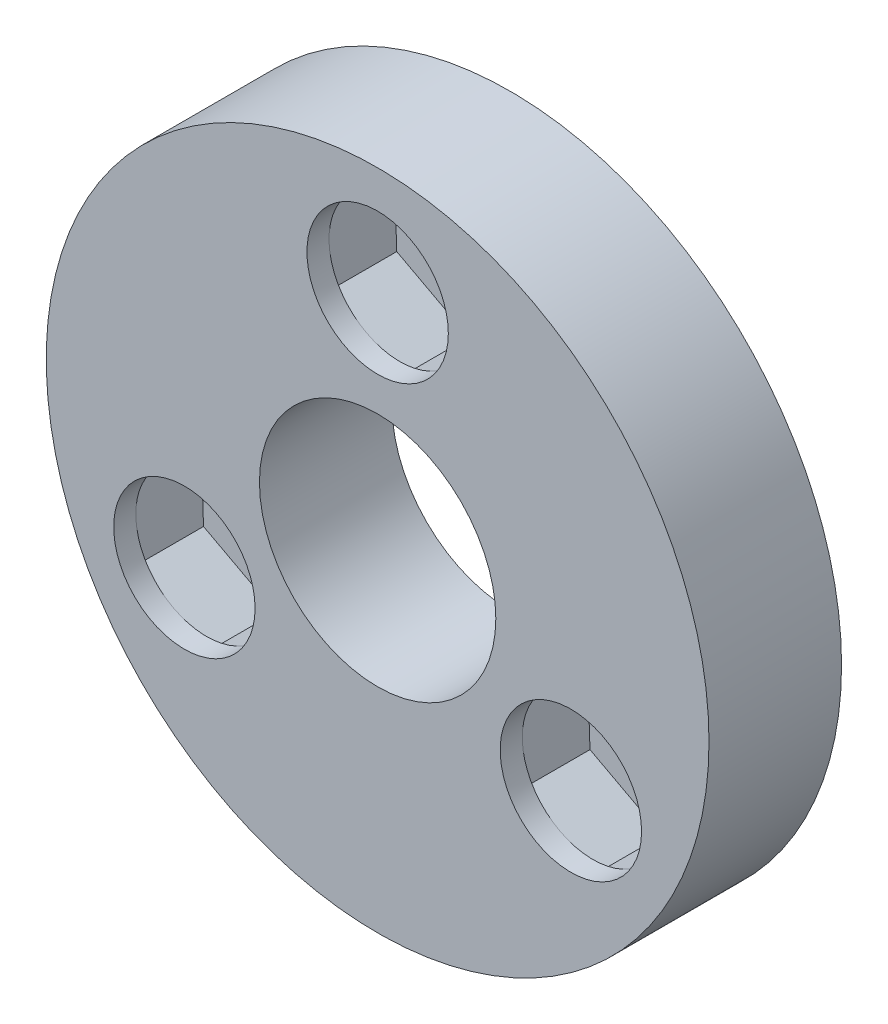
ISO-10303-21;
HEADER;
FILE_DESCRIPTION(('STEP AP214'),'2;1');
FILE_NAME('part.step','',(''),(''),'','','');
FILE_SCHEMA(('AUTOMOTIVE_DESIGN { 1 0 10303 214 1 1 1 1 }'));
ENDSEC;
DATA;
#1=APPLICATION_CONTEXT('core data for automotive mechanical design processes');
#2=APPLICATION_PROTOCOL_DEFINITION('international standard','automotive_design',2000,#1);
#3=PRODUCT_CONTEXT('',#1,'mechanical');
#4=PRODUCT('Part','Part','',(#3));
#5=PRODUCT_RELATED_PRODUCT_CATEGORY('part','',(#4));
#6=PRODUCT_DEFINITION_FORMATION('','',#4);
#7=PRODUCT_DEFINITION_CONTEXT('part definition',#1,'design');
#8=PRODUCT_DEFINITION('design','',#6,#7);
#9=PRODUCT_DEFINITION_SHAPE('','',#8);
#10=(LENGTH_UNIT() NAMED_UNIT(*) SI_UNIT(.MILLI.,.METRE.));
#11=(NAMED_UNIT(*) PLANE_ANGLE_UNIT() SI_UNIT($,.RADIAN.));
#12=(NAMED_UNIT(*) SI_UNIT($,.STERADIAN.) SOLID_ANGLE_UNIT());
#13=UNCERTAINTY_MEASURE_WITH_UNIT(LENGTH_MEASURE(1.E-05),#10,'distance_accuracy_value','');
#14=(GEOMETRIC_REPRESENTATION_CONTEXT(3) GLOBAL_UNCERTAINTY_ASSIGNED_CONTEXT((#13)) GLOBAL_UNIT_ASSIGNED_CONTEXT((#10,
#11,#12)) REPRESENTATION_CONTEXT('',''));
#15=CARTESIAN_POINT('',(0.,0.,0.));
#16=DIRECTION('',(0.,0.,1.));
#17=DIRECTION('',(1.,0.,0.));
#18=AXIS2_PLACEMENT_3D('',#15,#16,#17);
#19=CARTESIAN_POINT('',(0.,0.,5.));
#20=DIRECTION('',(0.,0.,1.));
#21=DIRECTION('',(1.,0.,0.));
#22=AXIS2_PLACEMENT_3D('',#19,#20,#21);
#23=PLANE('',#22);
#24=DIRECTION('',(-0.0343694871915413,0.999409194649614,0.));
#25=VECTOR('',#24,1.);
#26=CARTESIAN_POINT('',(-5.48524881076183,-6.78644697718401,5.));
#27=LINE('',#26,#25);
#28=CARTESIAN_POINT('',(-5.54874715534405,-4.94001764098746,5.));
#29=VERTEX_POINT('',#28);
#30=CARTESIAN_POINT('',(-5.61224549992629,-3.09358830479014,5.));
#31=VERTEX_POINT('',#30);
#32=EDGE_CURVE('E378',#29,#31,#27,.T.);
#33=ORIENTED_EDGE('',*,*,#32,.F.);
#34=CARTESIAN_POINT('',(-8.74685657822219,-5.05000000000037,5.));
#35=DIRECTION('',(0.,0.,1.));
#36=DIRECTION('',(1.,0.,0.));
#37=AXIS2_PLACEMENT_3D('',#34,#35,#36);
#38=CIRCLE('',#37,3.20000000000081);
#39=CARTESIAN_POINT('',(-7.24304938365613,-2.22536481619848,5.));
#40=VERTEX_POINT('',#39);
#41=EDGE_CURVE('E224',#29,#40,#38,.T.);
#42=ORIENTED_EDGE('',*,*,#41,.T.);
#43=DIRECTION('',(-0.882698494938083,0.469939748301889,0.));
#44=VECTOR('',#43,1.);
#45=CARTESIAN_POINT('',(-5.61224549992629,-3.09358830479014,5.));
#46=LINE('',#45,#44);
#47=EDGE_CURVE('E380',#31,#40,#46,.T.);
#48=ORIENTED_EDGE('',*,*,#47,.F.);
#49=EDGE_LOOP('',(#33,#42,#48));
#50=FACE_BOUND('',#49,.T.);
#51=ADVANCED_FACE('F39',(#50),#23,.F.);
#52=CARTESIAN_POINT('',(-8.87385326738728,-1.35714132760614,5.));
#53=VERTEX_POINT('',#52);
#54=EDGE_CURVE('E281',#40,#53,#46,.T.);
#55=ORIENTED_EDGE('',*,*,#54,.F.);
#56=CARTESIAN_POINT('',(-10.4411588065353,-2.33534717521088,5.));
#57=VERTEX_POINT('',#56);
#58=EDGE_CURVE('E305',#40,#57,#38,.T.);
#59=ORIENTED_EDGE('',*,*,#58,.T.);
#60=DIRECTION('',(-0.848329007746543,-0.529469446347725,0.));
#61=VECTOR('',#60,1.);
#62=CARTESIAN_POINT('',(-8.87385326738728,-1.35714132760614,5.));
#63=LINE('',#62,#61);
#64=EDGE_CURVE('E259',#53,#57,#63,.T.);
#65=ORIENTED_EDGE('',*,*,#64,.F.);
#66=EDGE_LOOP('',(#55,#59,#65));
#67=FACE_BOUND('',#66,.T.);
#68=ADVANCED_FACE('F394',(#67),#23,.F.);
#69=CARTESIAN_POINT('',(-12.0084643456838,-3.313553022816,5.));
#70=VERTEX_POINT('',#69);
#71=EDGE_CURVE('E258',#57,#70,#63,.T.);
#72=ORIENTED_EDGE('',*,*,#71,.F.);
#73=CARTESIAN_POINT('',(-11.9449660011016,-5.15998235901332,5.));
#74=VERTEX_POINT('',#73);
#75=EDGE_CURVE('E395',#57,#74,#38,.T.);
#76=ORIENTED_EDGE('',*,*,#75,.T.);
#77=DIRECTION('',(0.0343694871915401,-0.999409194649614,0.));
#78=VECTOR('',#77,1.);
#79=CARTESIAN_POINT('',(-12.0084643456838,-3.313553022816,5.));
#80=LINE('',#79,#78);
#81=EDGE_CURVE('E253',#70,#74,#80,.T.);
#82=ORIENTED_EDGE('',*,*,#81,.F.);
#83=EDGE_LOOP('',(#72,#76,#82));
#84=FACE_BOUND('',#83,.T.);
#85=ADVANCED_FACE('F399',(#84),#23,.F.);
#86=CARTESIAN_POINT('',(-11.8814676565194,-7.00641169520987,5.));
#87=VERTEX_POINT('',#86);
#88=EDGE_CURVE('E251',#74,#87,#80,.T.);
#89=ORIENTED_EDGE('',*,*,#88,.F.);
#90=CARTESIAN_POINT('',(-10.2506637727882,-7.87463518380222,5.));
#91=VERTEX_POINT('',#90);
#92=EDGE_CURVE('E240',#74,#91,#38,.T.);
#93=ORIENTED_EDGE('',*,*,#92,.T.);
#94=DIRECTION('',(0.882698494938083,-0.469939748301888,0.));
#95=VECTOR('',#94,1.);
#96=CARTESIAN_POINT('',(-11.8814676565194,-7.00641169520987,5.));
#97=LINE('',#96,#95);
#98=EDGE_CURVE('E248',#87,#91,#97,.T.);
#99=ORIENTED_EDGE('',*,*,#98,.F.);
#100=EDGE_LOOP('',(#89,#93,#99));
#101=FACE_BOUND('',#100,.T.);
#102=ADVANCED_FACE('F415',(#101),#23,.F.);
#103=CARTESIAN_POINT('',(-8.61985988905838,-8.74285867239387,5.));
#104=VERTEX_POINT('',#103);
#105=EDGE_CURVE('E232',#91,#104,#97,.T.);
#106=ORIENTED_EDGE('',*,*,#105,.F.);
#107=CARTESIAN_POINT('',(-7.05255434990981,-7.76465282478876,5.));
#108=VERTEX_POINT('',#107);
#109=EDGE_CURVE('E218',#91,#108,#38,.T.);
#110=ORIENTED_EDGE('',*,*,#109,.T.);
#111=DIRECTION('',(0.848329007746543,0.529469446347725,0.));
#112=VECTOR('',#111,1.);
#113=CARTESIAN_POINT('',(-8.61985988905838,-8.74285867239387,5.));
#114=LINE('',#113,#112);
#115=EDGE_CURVE('E234',#104,#108,#114,.T.);
#116=ORIENTED_EDGE('',*,*,#115,.F.);
#117=EDGE_LOOP('',(#106,#110,#116));
#118=FACE_BOUND('',#117,.T.);
#119=ADVANCED_FACE('F235',(#118),#23,.F.);
#120=CARTESIAN_POINT('',(-8.87385326738728,-1.35714132760614,2.));
#121=DIRECTION('',(-0.529469446347725,0.848329007746543,0.));
#122=DIRECTION('',(-0.848329007746543,-0.529469446347725,0.));
#123=AXIS2_PLACEMENT_3D('',#120,#121,#122);
#124=PLANE('',#123);
#125=ORIENTED_EDGE('',*,*,#64,.T.);
#126=ORIENTED_EDGE('',*,*,#71,.T.);
#127=DIRECTION('',(0.,0.,1.));
#128=VECTOR('',#127,1.);
#129=CARTESIAN_POINT('',(-12.0084643456838,-3.313553022816,2.));
#130=LINE('',#129,#128);
#131=CARTESIAN_POINT('',(-12.0084643456838,-3.313553022816,2.));
#132=VERTEX_POINT('',#131);
#133=EDGE_CURVE('E269',#132,#70,#130,.T.);
#134=ORIENTED_EDGE('',*,*,#133,.F.);
#135=DIRECTION('',(-0.848329007746543,-0.529469446347725,0.));
#136=VECTOR('',#135,1.);
#137=CARTESIAN_POINT('',(-8.87385326738728,-1.35714132760614,2.));
#138=LINE('',#137,#136);
#139=CARTESIAN_POINT('',(-8.87385326738728,-1.35714132760614,2.));
#140=VERTEX_POINT('',#139);
#141=EDGE_CURVE('E279',#140,#132,#138,.T.);
#142=ORIENTED_EDGE('',*,*,#141,.F.);
#143=DIRECTION('',(0.,0.,1.));
#144=VECTOR('',#143,1.);
#145=CARTESIAN_POINT('',(-8.87385326738728,-1.35714132760614,2.));
#146=LINE('',#145,#144);
#147=EDGE_CURVE('E372',#140,#53,#146,.T.);
#148=ORIENTED_EDGE('',*,*,#147,.T.);
#149=EDGE_LOOP('',(#125,#126,#134,#142,#148));
#150=FACE_BOUND('',#149,.T.);
#151=ADVANCED_FACE('F386',(#150),#124,.F.);
#152=CARTESIAN_POINT('',(-5.61224549992629,-3.09358830479014,2.));
#153=DIRECTION('',(0.469939748301889,0.882698494938083,0.));
#154=DIRECTION('',(-0.882698494938083,0.469939748301889,0.));
#155=AXIS2_PLACEMENT_3D('',#152,#153,#154);
#156=PLANE('',#155);
#157=ORIENTED_EDGE('',*,*,#47,.T.);
#158=ORIENTED_EDGE('',*,*,#54,.T.);
#159=ORIENTED_EDGE('',*,*,#147,.F.);
#160=DIRECTION('',(-0.882698494938083,0.469939748301889,0.));
#161=VECTOR('',#160,1.);
#162=CARTESIAN_POINT('',(-5.61224549992629,-3.09358830479014,2.));
#163=LINE('',#162,#161);
#164=CARTESIAN_POINT('',(-5.61224549992629,-3.09358830479014,2.));
#165=VERTEX_POINT('',#164);
#166=EDGE_CURVE('E265',#165,#140,#163,.T.);
#167=ORIENTED_EDGE('',*,*,#166,.F.);
#168=DIRECTION('',(0.,0.,1.));
#169=VECTOR('',#168,1.);
#170=CARTESIAN_POINT('',(-5.61224549992629,-3.09358830479014,2.));
#171=LINE('',#170,#169);
#172=EDGE_CURVE('E371',#165,#31,#171,.T.);
#173=ORIENTED_EDGE('',*,*,#172,.T.);
#174=EDGE_LOOP('',(#157,#158,#159,#167,#173));
#175=FACE_BOUND('',#174,.T.);
#176=ADVANCED_FACE('F384',(#175),#156,.F.);
#177=CARTESIAN_POINT('',(-5.48524881076183,-6.78644697718401,2.));
#178=DIRECTION('',(0.999409194649614,0.0343694871915413,0.));
#179=DIRECTION('',(-0.0343694871915413,0.999409194649614,0.));
#180=AXIS2_PLACEMENT_3D('',#177,#178,#179);
#181=PLANE('',#180);
#182=CARTESIAN_POINT('',(-5.48524881076183,-6.78644697718401,5.));
#183=VERTEX_POINT('',#182);
#184=EDGE_CURVE('E241',#183,#29,#27,.T.);
#185=ORIENTED_EDGE('',*,*,#184,.T.);
#186=ORIENTED_EDGE('',*,*,#32,.T.);
#187=ORIENTED_EDGE('',*,*,#172,.F.);
#188=DIRECTION('',(-0.0343694871915413,0.999409194649614,0.));
#189=VECTOR('',#188,1.);
#190=CARTESIAN_POINT('',(-5.48524881076183,-6.78644697718401,2.));
#191=LINE('',#190,#189);
#192=CARTESIAN_POINT('',(-5.48524881076183,-6.78644697718401,2.));
#193=VERTEX_POINT('',#192);
#194=EDGE_CURVE('E268',#193,#165,#191,.T.);
#195=ORIENTED_EDGE('',*,*,#194,.F.);
#196=DIRECTION('',(0.,0.,1.));
#197=VECTOR('',#196,1.);
#198=CARTESIAN_POINT('',(-5.48524881076183,-6.78644697718401,2.));
#199=LINE('',#198,#197);
#200=EDGE_CURVE('E367',#193,#183,#199,.T.);
#201=ORIENTED_EDGE('',*,*,#200,.T.);
#202=EDGE_LOOP('',(#185,#186,#187,#195,#201));
#203=FACE_BOUND('',#202,.T.);
#204=ADVANCED_FACE('F408',(#203),#181,.F.);
#205=CARTESIAN_POINT('',(-8.61985988905838,-8.74285867239387,2.));
#206=DIRECTION('',(0.529469446347725,-0.848329007746542,0.));
#207=DIRECTION('',(0.848329007746543,0.529469446347725,0.));
#208=AXIS2_PLACEMENT_3D('',#205,#206,#207);
#209=PLANE('',#208);
#210=ORIENTED_EDGE('',*,*,#115,.T.);
#211=EDGE_CURVE('E238',#108,#183,#114,.T.);
#212=ORIENTED_EDGE('',*,*,#211,.T.);
#213=ORIENTED_EDGE('',*,*,#200,.F.);
#214=DIRECTION('',(0.848329007746543,0.529469446347725,0.));
#215=VECTOR('',#214,1.);
#216=CARTESIAN_POINT('',(-8.61985988905838,-8.74285867239387,2.));
#217=LINE('',#216,#215);
#218=CARTESIAN_POINT('',(-8.61985988905838,-8.74285867239387,2.));
#219=VERTEX_POINT('',#218);
#220=EDGE_CURVE('E266',#219,#193,#217,.T.);
#221=ORIENTED_EDGE('',*,*,#220,.F.);
#222=DIRECTION('',(0.,0.,1.));
#223=VECTOR('',#222,1.);
#224=CARTESIAN_POINT('',(-8.61985988905838,-8.74285867239387,2.));
#225=LINE('',#224,#223);
#226=EDGE_CURVE('E247',#219,#104,#225,.T.);
#227=ORIENTED_EDGE('',*,*,#226,.T.);
#228=EDGE_LOOP('',(#210,#212,#213,#221,#227));
#229=FACE_BOUND('',#228,.T.);
#230=ADVANCED_FACE('F246',(#229),#209,.F.);
#231=CARTESIAN_POINT('',(-11.8814676565194,-7.00641169520987,2.));
#232=DIRECTION('',(-0.469939748301888,-0.882698494938084,0.));
#233=DIRECTION('',(0.882698494938084,-0.469939748301888,0.));
#234=AXIS2_PLACEMENT_3D('',#231,#232,#233);
#235=PLANE('',#234);
#236=ORIENTED_EDGE('',*,*,#98,.T.);
#237=ORIENTED_EDGE('',*,*,#105,.T.);
#238=ORIENTED_EDGE('',*,*,#226,.F.);
#239=DIRECTION('',(0.882698494938083,-0.469939748301888,0.));
#240=VECTOR('',#239,1.);
#241=CARTESIAN_POINT('',(-11.8814676565194,-7.00641169520987,2.));
#242=LINE('',#241,#240);
#243=CARTESIAN_POINT('',(-11.8814676565194,-7.00641169520987,2.));
#244=VERTEX_POINT('',#243);
#245=EDGE_CURVE('E271',#244,#219,#242,.T.);
#246=ORIENTED_EDGE('',*,*,#245,.F.);
#247=DIRECTION('',(0.,0.,1.));
#248=VECTOR('',#247,1.);
#249=CARTESIAN_POINT('',(-11.8814676565194,-7.00641169520987,2.));
#250=LINE('',#249,#248);
#251=EDGE_CURVE('E362',#244,#87,#250,.T.);
#252=ORIENTED_EDGE('',*,*,#251,.T.);
#253=EDGE_LOOP('',(#236,#237,#238,#246,#252));
#254=FACE_BOUND('',#253,.T.);
#255=ADVANCED_FACE('F406',(#254),#235,.F.);
#256=CARTESIAN_POINT('',(-12.0084643456838,-3.313553022816,2.));
#257=DIRECTION('',(-0.999409194649614,-0.0343694871915401,0.));
#258=DIRECTION('',(0.0343694871915401,-0.999409194649614,0.));
#259=AXIS2_PLACEMENT_3D('',#256,#257,#258);
#260=PLANE('',#259);
#261=ORIENTED_EDGE('',*,*,#81,.T.);
#262=ORIENTED_EDGE('',*,*,#88,.T.);
#263=ORIENTED_EDGE('',*,*,#251,.F.);
#264=DIRECTION('',(0.0343694871915401,-0.999409194649614,0.));
#265=VECTOR('',#264,1.);
#266=CARTESIAN_POINT('',(-12.0084643456838,-3.313553022816,2.));
#267=LINE('',#266,#265);
#268=EDGE_CURVE('E277',#132,#244,#267,.T.);
#269=ORIENTED_EDGE('',*,*,#268,.F.);
#270=ORIENTED_EDGE('',*,*,#133,.T.);
#271=EDGE_LOOP('',(#261,#262,#263,#269,#270));
#272=FACE_BOUND('',#271,.T.);
#273=ADVANCED_FACE('F402',(#272),#260,.F.);
#274=CARTESIAN_POINT('',(0.,0.,2.));
#275=DIRECTION('',(0.,0.,1.));
#276=DIRECTION('',(1.,0.,0.));
#277=AXIS2_PLACEMENT_3D('',#274,#275,#276);
#278=PLANE('',#277);
#279=ORIENTED_EDGE('',*,*,#141,.T.);
#280=ORIENTED_EDGE('',*,*,#268,.T.);
#281=ORIENTED_EDGE('',*,*,#245,.T.);
#282=ORIENTED_EDGE('',*,*,#220,.T.);
#283=ORIENTED_EDGE('',*,*,#194,.T.);
#284=ORIENTED_EDGE('',*,*,#166,.T.);
#285=EDGE_LOOP('',(#279,#280,#281,#282,#283,#284));
#286=FACE_BOUND('',#285,.T.);
#287=ADVANCED_FACE('F404',(#286),#278,.T.);
#288=ORIENTED_EDGE('',*,*,#211,.F.);
#289=EDGE_CURVE('E219',#108,#29,#38,.T.);
#290=ORIENTED_EDGE('',*,*,#289,.T.);
#291=ORIENTED_EDGE('',*,*,#184,.F.);
#292=EDGE_LOOP('',(#288,#290,#291));
#293=FACE_BOUND('',#292,.T.);
#294=ADVANCED_FACE('F237',(#293),#23,.F.);
#295=CARTESIAN_POINT('',(-8.74685657822219,-5.05000000000037,3.5));
#296=DIRECTION('',(0.,0.,1.));
#297=DIRECTION('',(1.,0.,0.));
#298=AXIS2_PLACEMENT_3D('',#295,#296,#297);
#299=CYLINDRICAL_SURFACE('',#298,3.20000000000081);
#300=CARTESIAN_POINT('',(-8.74685657822219,-5.05000000000037,6.));
#301=DIRECTION('',(0.,0.,1.));
#302=DIRECTION('',(1.,0.,0.));
#303=AXIS2_PLACEMENT_3D('',#300,#301,#302);
#304=CIRCLE('',#303,3.20000000000081);
#305=CARTESIAN_POINT('',(-5.54685657822138,-5.05000000000037,6.));
#306=VERTEX_POINT('',#305);
#307=EDGE_CURVE('E932',#306,#306,#304,.T.);
#308=ORIENTED_EDGE('',*,*,#307,.T.);
#309=EDGE_LOOP('',(#308));
#310=FACE_BOUND('',#309,.T.);
#311=ORIENTED_EDGE('',*,*,#289,.F.);
#312=ORIENTED_EDGE('',*,*,#109,.F.);
#313=ORIENTED_EDGE('',*,*,#92,.F.);
#314=ORIENTED_EDGE('',*,*,#75,.F.);
#315=ORIENTED_EDGE('',*,*,#58,.F.);
#316=ORIENTED_EDGE('',*,*,#41,.F.);
#317=EDGE_LOOP('',(#311,#312,#313,#314,#315,#316));
#318=FACE_BOUND('',#317,.T.);
#319=ADVANCED_FACE('F220',(#310,#318),#299,.F.);
#320=CARTESIAN_POINT('',(0.,0.,6.));
#321=DIRECTION('',(0.,0.,-1.));
#322=DIRECTION('',(-1.,0.,0.));
#323=AXIS2_PLACEMENT_3D('',#320,#321,#322);
#324=CYLINDRICAL_SURFACE('',#323,15.);
#325=CARTESIAN_POINT('',(0.,0.,6.));
#326=DIRECTION('',(0.,0.,1.));
#327=DIRECTION('',(1.,0.,0.));
#328=AXIS2_PLACEMENT_3D('',#325,#326,#327);
#329=CIRCLE('',#328,15.);
#330=CARTESIAN_POINT('',(15.,0.,6.));
#331=VERTEX_POINT('',#330);
#332=EDGE_CURVE('E227',#331,#331,#329,.T.);
#333=ORIENTED_EDGE('',*,*,#332,.F.);
#334=EDGE_LOOP('',(#333));
#335=FACE_BOUND('',#334,.T.);
#336=CARTESIAN_POINT('',(0.,0.,0.));
#337=DIRECTION('',(0.,0.,1.));
#338=DIRECTION('',(1.,0.,0.));
#339=AXIS2_PLACEMENT_3D('',#336,#337,#338);
#340=CIRCLE('',#339,15.);
#341=CARTESIAN_POINT('',(15.,0.,0.));
#342=VERTEX_POINT('',#341);
#343=EDGE_CURVE('E286',#342,#342,#340,.T.);
#344=ORIENTED_EDGE('',*,*,#343,.T.);
#345=EDGE_LOOP('',(#344));
#346=FACE_BOUND('',#345,.T.);
#347=ADVANCED_FACE('F41',(#335,#346),#324,.T.);
#348=CARTESIAN_POINT('',(0.,0.,6.));
#349=DIRECTION('',(0.,0.,1.));
#350=DIRECTION('',(1.,0.,0.));
#351=AXIS2_PLACEMENT_3D('',#348,#349,#350);
#352=PLANE('',#351);
#353=CARTESIAN_POINT('',(8.74685657822348,-5.04999999999963,6.));
#354=DIRECTION('',(0.,0.,1.));
#355=DIRECTION('',(1.,0.,0.));
#356=AXIS2_PLACEMENT_3D('',#353,#354,#355);
#357=CIRCLE('',#356,3.20000000000055);
#358=CARTESIAN_POINT('',(11.946856578224,-5.04999999999963,6.));
#359=VERTEX_POINT('',#358);
#360=EDGE_CURVE('E376',#359,#359,#357,.T.);
#361=ORIENTED_EDGE('',*,*,#360,.F.);
#362=EDGE_LOOP('',(#361));
#363=FACE_BOUND('',#362,.T.);
#364=CARTESIAN_POINT('',(0.,10.1,6.));
#365=DIRECTION('',(0.,0.,1.));
#366=DIRECTION('',(1.,0.,0.));
#367=AXIS2_PLACEMENT_3D('',#364,#365,#366);
#368=CIRCLE('',#367,3.2);
#369=CARTESIAN_POINT('',(3.2,10.1,6.));
#370=VERTEX_POINT('',#369);
#371=EDGE_CURVE('E817',#370,#370,#368,.T.);
#372=ORIENTED_EDGE('',*,*,#371,.F.);
#373=EDGE_LOOP('',(#372));
#374=FACE_BOUND('',#373,.T.);
#375=ORIENTED_EDGE('',*,*,#307,.F.);
#376=EDGE_LOOP('',(#375));
#377=FACE_BOUND('',#376,.T.);
#378=CARTESIAN_POINT('',(0.,0.,6.));
#379=DIRECTION('',(0.,0.,1.));
#380=DIRECTION('',(1.,0.,0.));
#381=AXIS2_PLACEMENT_3D('',#378,#379,#380);
#382=CIRCLE('',#381,5.35);
#383=CARTESIAN_POINT('',(5.35,0.,6.));
#384=VERTEX_POINT('',#383);
#385=EDGE_CURVE('E288',#384,#384,#382,.T.);
#386=ORIENTED_EDGE('',*,*,#385,.F.);
#387=EDGE_LOOP('',(#386));
#388=FACE_BOUND('',#387,.T.);
#389=ORIENTED_EDGE('',*,*,#332,.T.);
#390=EDGE_LOOP('',(#389));
#391=FACE_BOUND('',#390,.T.);
#392=ADVANCED_FACE('F444',(#363,#374,#377,#388,#391),#352,.T.);
#393=CARTESIAN_POINT('',(0.,0.,0.));
#394=DIRECTION('',(0.,0.,1.));
#395=DIRECTION('',(1.,0.,0.));
#396=AXIS2_PLACEMENT_3D('',#393,#394,#395);
#397=PLANE('',#396);
#398=CARTESIAN_POINT('',(0.,0.,0.));
#399=DIRECTION('',(0.,0.,-1.));
#400=DIRECTION('',(-1.,0.,0.));
#401=AXIS2_PLACEMENT_3D('',#398,#399,#400);
#402=CIRCLE('',#401,5.35);
#403=CARTESIAN_POINT('',(-5.35,0.,0.));
#404=VERTEX_POINT('',#403);
#405=EDGE_CURVE('E285',#404,#404,#402,.T.);
#406=ORIENTED_EDGE('',*,*,#405,.F.);
#407=EDGE_LOOP('',(#406));
#408=FACE_BOUND('',#407,.T.);
#409=ORIENTED_EDGE('',*,*,#343,.F.);
#410=EDGE_LOOP('',(#409));
#411=FACE_BOUND('',#410,.T.);
#412=ADVANCED_FACE('F442',(#408,#411),#397,.F.);
#413=CARTESIAN_POINT('',(0.,0.,11.5));
#414=DIRECTION('',(0.,0.,-1.));
#415=DIRECTION('',(-1.,0.,0.));
#416=AXIS2_PLACEMENT_3D('',#413,#414,#415);
#417=CYLINDRICAL_SURFACE('',#416,5.35);
#418=ORIENTED_EDGE('',*,*,#385,.T.);
#419=EDGE_LOOP('',(#418));
#420=FACE_BOUND('',#419,.T.);
#421=ORIENTED_EDGE('',*,*,#405,.T.);
#422=EDGE_LOOP('',(#421));
#423=FACE_BOUND('',#422,.T.);
#424=ADVANCED_FACE('F437',(#420,#423),#417,.F.);
#425=CARTESIAN_POINT('',(8.74685657822348,-5.04999999999963,3.5));
#426=DIRECTION('',(0.,0.,1.));
#427=DIRECTION('',(1.,0.,0.));
#428=AXIS2_PLACEMENT_3D('',#425,#426,#427);
#429=CYLINDRICAL_SURFACE('',#428,3.20000000000055);
#430=ORIENTED_EDGE('',*,*,#360,.T.);
#431=EDGE_LOOP('',(#430));
#432=FACE_BOUND('',#431,.T.);
#433=CARTESIAN_POINT('',(8.74685657822348,-5.04999999999963,5.));
#434=DIRECTION('',(0.,0.,1.));
#435=DIRECTION('',(1.,0.,0.));
#436=AXIS2_PLACEMENT_3D('',#433,#434,#435);
#437=CIRCLE('',#436,3.20000000000055);
#438=CARTESIAN_POINT('',(10.4411588065362,-7.76465282478854,5.));
#439=VERTEX_POINT('',#438);
#440=CARTESIAN_POINT('',(11.9449660011016,-4.94001764098672,5.));
#441=VERTEX_POINT('',#440);
#442=EDGE_CURVE('E295',#439,#441,#437,.T.);
#443=ORIENTED_EDGE('',*,*,#442,.F.);
#444=CARTESIAN_POINT('',(7.24304938365714,-7.87463518380205,5.));
#445=VERTEX_POINT('',#444);
#446=EDGE_CURVE('E294',#445,#439,#437,.T.);
#447=ORIENTED_EDGE('',*,*,#446,.F.);
#448=CARTESIAN_POINT('',(5.54874715534405,-5.15998235901258,5.));
#449=VERTEX_POINT('',#448);
#450=EDGE_CURVE('E301',#449,#445,#437,.T.);
#451=ORIENTED_EDGE('',*,*,#450,.F.);
#452=CARTESIAN_POINT('',(7.05255434991074,-2.33534717521067,5.));
#453=VERTEX_POINT('',#452);
#454=EDGE_CURVE('E307',#453,#449,#437,.T.);
#455=ORIENTED_EDGE('',*,*,#454,.F.);
#456=CARTESIAN_POINT('',(10.2506637727892,-2.22536481619832,5.));
#457=VERTEX_POINT('',#456);
#458=EDGE_CURVE('E303',#457,#453,#437,.T.);
#459=ORIENTED_EDGE('',*,*,#458,.F.);
#460=EDGE_CURVE('E62',#441,#457,#437,.T.);
#461=ORIENTED_EDGE('',*,*,#460,.F.);
#462=EDGE_LOOP('',(#443,#447,#451,#455,#459,#461));
#463=FACE_BOUND('',#462,.T.);
#464=ADVANCED_FACE('F445',(#432,#463),#429,.F.);
#465=CARTESIAN_POINT('',(0.,10.1,3.5));
#466=DIRECTION('',(0.,0.,1.));
#467=DIRECTION('',(1.,0.,0.));
#468=AXIS2_PLACEMENT_3D('',#465,#466,#467);
#469=CYLINDRICAL_SURFACE('',#468,3.2);
#470=ORIENTED_EDGE('',*,*,#371,.T.);
#471=EDGE_LOOP('',(#470));
#472=FACE_BOUND('',#471,.T.);
#473=CARTESIAN_POINT('',(0.,10.1,5.));
#474=DIRECTION('',(0.,0.,1.));
#475=DIRECTION('',(1.,0.,0.));
#476=AXIS2_PLACEMENT_3D('',#473,#474,#475);
#477=CIRCLE('',#476,3.2);
#478=CARTESIAN_POINT('',(1.69430222831272,7.38534717521106,5.));
#479=VERTEX_POINT('',#478);
#480=CARTESIAN_POINT('',(3.19810942287877,10.2099823590129,5.));
#481=VERTEX_POINT('',#480);
#482=EDGE_CURVE('E43',#479,#481,#477,.T.);
#483=ORIENTED_EDGE('',*,*,#482,.F.);
#484=CARTESIAN_POINT('',(-1.50380719456605,7.27536481619813,5.));
#485=VERTEX_POINT('',#484);
#486=EDGE_CURVE('E310',#485,#479,#477,.T.);
#487=ORIENTED_EDGE('',*,*,#486,.F.);
#488=CARTESIAN_POINT('',(-3.19810942287877,9.99001764098707,5.));
#489=VERTEX_POINT('',#488);
#490=EDGE_CURVE('E835',#489,#485,#477,.T.);
#491=ORIENTED_EDGE('',*,*,#490,.F.);
#492=CARTESIAN_POINT('',(-1.69430222831272,12.8146528247889,5.));
#493=VERTEX_POINT('',#492);
#494=EDGE_CURVE('E925',#493,#489,#477,.T.);
#495=ORIENTED_EDGE('',*,*,#494,.F.);
#496=CARTESIAN_POINT('',(1.50380719456605,12.9246351838019,5.));
#497=VERTEX_POINT('',#496);
#498=EDGE_CURVE('E48',#497,#493,#477,.T.);
#499=ORIENTED_EDGE('',*,*,#498,.F.);
#500=EDGE_CURVE('E11',#481,#497,#477,.T.);
#501=ORIENTED_EDGE('',*,*,#500,.F.);
#502=EDGE_LOOP('',(#483,#487,#491,#495,#499,#501));
#503=FACE_BOUND('',#502,.T.);
#504=ADVANCED_FACE('F752',(#472,#503),#469,.F.);
#505=CARTESIAN_POINT('',(0.,0.,5.));
#506=DIRECTION('',(0.,0.,1.));
#507=DIRECTION('',(1.,0.,0.));
#508=AXIS2_PLACEMENT_3D('',#505,#506,#507);
#509=PLANE('',#508);
#510=DIRECTION('',(-0.034369487191541,0.999409194649614,0.));
#511=VECTOR('',#510,1.);
#512=CARTESIAN_POINT('',(12.0084643456838,-6.78644697718401,5.));
#513=LINE('',#512,#511);
#514=CARTESIAN_POINT('',(11.8814676565194,-3.09358830479013,5.));
#515=VERTEX_POINT('',#514);
#516=EDGE_CURVE('E886',#441,#515,#513,.T.);
#517=ORIENTED_EDGE('',*,*,#516,.F.);
#518=ORIENTED_EDGE('',*,*,#460,.T.);
#519=DIRECTION('',(-0.882698494938083,0.46993974830189,0.));
#520=VECTOR('',#519,1.);
#521=CARTESIAN_POINT('',(11.8814676565194,-3.09358830479013,5.));
#522=LINE('',#521,#520);
#523=EDGE_CURVE('E884',#515,#457,#522,.T.);
#524=ORIENTED_EDGE('',*,*,#523,.F.);
#525=EDGE_LOOP('',(#517,#518,#524));
#526=FACE_BOUND('',#525,.T.);
#527=ADVANCED_FACE('F645',(#526),#509,.F.);
#528=CARTESIAN_POINT('',(8.61985988905838,-1.35714132760613,5.));
#529=VERTEX_POINT('',#528);
#530=EDGE_CURVE('E881',#457,#529,#522,.T.);
#531=ORIENTED_EDGE('',*,*,#530,.F.);
#532=ORIENTED_EDGE('',*,*,#458,.T.);
#533=DIRECTION('',(-0.848329007746542,-0.529469446347725,0.));
#534=VECTOR('',#533,1.);
#535=CARTESIAN_POINT('',(8.61985988905838,-1.35714132760613,5.));
#536=LINE('',#535,#534);
#537=EDGE_CURVE('E879',#529,#453,#536,.T.);
#538=ORIENTED_EDGE('',*,*,#537,.F.);
#539=EDGE_LOOP('',(#531,#532,#538));
#540=FACE_BOUND('',#539,.T.);
#541=ADVANCED_FACE('F743',(#540),#509,.F.);
#542=CARTESIAN_POINT('',(5.48524881076184,-3.31355302281599,5.));
#543=VERTEX_POINT('',#542);
#544=EDGE_CURVE('E880',#453,#543,#536,.T.);
#545=ORIENTED_EDGE('',*,*,#544,.F.);
#546=ORIENTED_EDGE('',*,*,#454,.T.);
#547=DIRECTION('',(0.0343694871915412,-0.999409194649614,0.));
#548=VECTOR('',#547,1.);
#549=CARTESIAN_POINT('',(5.48524881076184,-3.31355302281599,5.));
#550=LINE('',#549,#548);
#551=EDGE_CURVE('E877',#543,#449,#550,.T.);
#552=ORIENTED_EDGE('',*,*,#551,.F.);
#553=EDGE_LOOP('',(#545,#546,#552));
#554=FACE_BOUND('',#553,.T.);
#555=ADVANCED_FACE('F733',(#554),#509,.F.);
#556=CARTESIAN_POINT('',(5.61224549992629,-7.00641169520986,5.));
#557=VERTEX_POINT('',#556);
#558=EDGE_CURVE('E324',#449,#557,#550,.T.);
#559=ORIENTED_EDGE('',*,*,#558,.F.);
#560=ORIENTED_EDGE('',*,*,#450,.T.);
#561=DIRECTION('',(0.882698494938083,-0.469939748301889,0.));
#562=VECTOR('',#561,1.);
#563=CARTESIAN_POINT('',(5.61224549992629,-7.00641169520986,5.));
#564=LINE('',#563,#562);
#565=EDGE_CURVE('E323',#557,#445,#564,.T.);
#566=ORIENTED_EDGE('',*,*,#565,.F.);
#567=EDGE_LOOP('',(#559,#560,#566));
#568=FACE_BOUND('',#567,.T.);
#569=ADVANCED_FACE('F322',(#568),#509,.F.);
#570=CARTESIAN_POINT('',(8.87385326738728,-8.74285867239387,5.));
#571=VERTEX_POINT('',#570);
#572=EDGE_CURVE('E330',#445,#571,#564,.T.);
#573=ORIENTED_EDGE('',*,*,#572,.F.);
#574=ORIENTED_EDGE('',*,*,#446,.T.);
#575=DIRECTION('',(0.848329007746543,0.529469446347725,0.));
#576=VECTOR('',#575,1.);
#577=CARTESIAN_POINT('',(8.87385326738728,-8.74285867239387,5.));
#578=LINE('',#577,#576);
#579=EDGE_CURVE('E333',#571,#439,#578,.T.);
#580=ORIENTED_EDGE('',*,*,#579,.F.);
#581=EDGE_LOOP('',(#573,#574,#580));
#582=FACE_BOUND('',#581,.T.);
#583=ADVANCED_FACE('F328',(#582),#509,.F.);
#584=CARTESIAN_POINT('',(5.61224549992629,-7.00641169520986,2.));
#585=DIRECTION('',(-0.469939748301889,-0.882698494938083,0.));
#586=DIRECTION('',(0.882698494938083,-0.469939748301889,0.));
#587=AXIS2_PLACEMENT_3D('',#584,#585,#586);
#588=PLANE('',#587);
#589=ORIENTED_EDGE('',*,*,#565,.T.);
#590=ORIENTED_EDGE('',*,*,#572,.T.);
#591=DIRECTION('',(0.,0.,1.));
#592=VECTOR('',#591,1.);
#593=CARTESIAN_POINT('',(8.87385326738728,-8.74285867239387,2.));
#594=LINE('',#593,#592);
#595=CARTESIAN_POINT('',(8.87385326738728,-8.74285867239387,2.));
#596=VERTEX_POINT('',#595);
#597=EDGE_CURVE('E350',#596,#571,#594,.T.);
#598=ORIENTED_EDGE('',*,*,#597,.F.);
#599=DIRECTION('',(0.882698494938083,-0.469939748301889,0.));
#600=VECTOR('',#599,1.);
#601=CARTESIAN_POINT('',(5.61224549992629,-7.00641169520986,2.));
#602=LINE('',#601,#600);
#603=CARTESIAN_POINT('',(5.61224549992629,-7.00641169520986,2.));
#604=VERTEX_POINT('',#603);
#605=EDGE_CURVE('E359',#604,#596,#602,.T.);
#606=ORIENTED_EDGE('',*,*,#605,.F.);
#607=DIRECTION('',(0.,0.,1.));
#608=VECTOR('',#607,1.);
#609=CARTESIAN_POINT('',(5.61224549992629,-7.00641169520986,2.));
#610=LINE('',#609,#608);
#611=EDGE_CURVE('E261',#604,#557,#610,.T.);
#612=ORIENTED_EDGE('',*,*,#611,.T.);
#613=EDGE_LOOP('',(#589,#590,#598,#606,#612));
#614=FACE_BOUND('',#613,.T.);
#615=ADVANCED_FACE('F337',(#614),#588,.F.);
#616=CARTESIAN_POINT('',(5.48524881076184,-3.31355302281599,2.));
#617=DIRECTION('',(-0.999409194649614,-0.0343694871915412,0.));
#618=DIRECTION('',(0.0343694871915412,-0.999409194649614,0.));
#619=AXIS2_PLACEMENT_3D('',#616,#617,#618);
#620=PLANE('',#619);
#621=ORIENTED_EDGE('',*,*,#551,.T.);
#622=ORIENTED_EDGE('',*,*,#558,.T.);
#623=ORIENTED_EDGE('',*,*,#611,.F.);
#624=DIRECTION('',(0.0343694871915412,-0.999409194649614,0.));
#625=VECTOR('',#624,1.);
#626=CARTESIAN_POINT('',(5.48524881076184,-3.31355302281599,2.));
#627=LINE('',#626,#625);
#628=CARTESIAN_POINT('',(5.48524881076184,-3.31355302281599,2.));
#629=VERTEX_POINT('',#628);
#630=EDGE_CURVE('E344',#629,#604,#627,.T.);
#631=ORIENTED_EDGE('',*,*,#630,.F.);
#632=DIRECTION('',(0.,0.,1.));
#633=VECTOR('',#632,1.);
#634=CARTESIAN_POINT('',(5.48524881076184,-3.31355302281599,2.));
#635=LINE('',#634,#633);
#636=EDGE_CURVE('E872',#629,#543,#635,.T.);
#637=ORIENTED_EDGE('',*,*,#636,.T.);
#638=EDGE_LOOP('',(#621,#622,#623,#631,#637));
#639=FACE_BOUND('',#638,.T.);
#640=ADVANCED_FACE('F575',(#639),#620,.F.);
#641=CARTESIAN_POINT('',(8.61985988905838,-1.35714132760613,2.));
#642=DIRECTION('',(-0.529469446347726,0.848329007746542,0.));
#643=DIRECTION('',(-0.848329007746542,-0.529469446347726,0.));
#644=AXIS2_PLACEMENT_3D('',#641,#642,#643);
#645=PLANE('',#644);
#646=ORIENTED_EDGE('',*,*,#537,.T.);
#647=ORIENTED_EDGE('',*,*,#544,.T.);
#648=ORIENTED_EDGE('',*,*,#636,.F.);
#649=DIRECTION('',(-0.848329007746542,-0.529469446347725,0.));
#650=VECTOR('',#649,1.);
#651=CARTESIAN_POINT('',(8.61985988905838,-1.35714132760613,2.));
#652=LINE('',#651,#650);
#653=CARTESIAN_POINT('',(8.61985988905838,-1.35714132760613,2.));
#654=VERTEX_POINT('',#653);
#655=EDGE_CURVE('E346',#654,#629,#652,.T.);
#656=ORIENTED_EDGE('',*,*,#655,.F.);
#657=DIRECTION('',(0.,0.,1.));
#658=VECTOR('',#657,1.);
#659=CARTESIAN_POINT('',(8.61985988905838,-1.35714132760613,2.));
#660=LINE('',#659,#658);
#661=EDGE_CURVE('E867',#654,#529,#660,.T.);
#662=ORIENTED_EDGE('',*,*,#661,.T.);
#663=EDGE_LOOP('',(#646,#647,#648,#656,#662));
#664=FACE_BOUND('',#663,.T.);
#665=ADVANCED_FACE('F585',(#664),#645,.F.);
#666=CARTESIAN_POINT('',(11.8814676565194,-3.09358830479013,2.));
#667=DIRECTION('',(0.469939748301889,0.882698494938083,0.));
#668=DIRECTION('',(-0.882698494938083,0.46993974830189,0.));
#669=AXIS2_PLACEMENT_3D('',#666,#667,#668);
#670=PLANE('',#669);
#671=ORIENTED_EDGE('',*,*,#523,.T.);
#672=ORIENTED_EDGE('',*,*,#530,.T.);
#673=ORIENTED_EDGE('',*,*,#661,.F.);
#674=DIRECTION('',(-0.882698494938083,0.46993974830189,0.));
#675=VECTOR('',#674,1.);
#676=CARTESIAN_POINT('',(11.8814676565194,-3.09358830479013,2.));
#677=LINE('',#676,#675);
#678=CARTESIAN_POINT('',(11.8814676565194,-3.09358830479013,2.));
#679=VERTEX_POINT('',#678);
#680=EDGE_CURVE('E353',#679,#654,#677,.T.);
#681=ORIENTED_EDGE('',*,*,#680,.F.);
#682=DIRECTION('',(0.,0.,1.));
#683=VECTOR('',#682,1.);
#684=CARTESIAN_POINT('',(11.8814676565194,-3.09358830479013,2.));
#685=LINE('',#684,#683);
#686=EDGE_CURVE('E866',#679,#515,#685,.T.);
#687=ORIENTED_EDGE('',*,*,#686,.T.);
#688=EDGE_LOOP('',(#671,#672,#673,#681,#687));
#689=FACE_BOUND('',#688,.T.);
#690=ADVANCED_FACE('F594',(#689),#670,.F.);
#691=CARTESIAN_POINT('',(12.0084643456838,-6.78644697718401,2.));
#692=DIRECTION('',(0.999409194649614,0.034369487191541,0.));
#693=DIRECTION('',(-0.034369487191541,0.999409194649614,0.));
#694=AXIS2_PLACEMENT_3D('',#691,#692,#693);
#695=PLANE('',#694);
#696=CARTESIAN_POINT('',(12.0084643456838,-6.78644697718401,5.));
#697=VERTEX_POINT('',#696);
#698=EDGE_CURVE('E890',#697,#441,#513,.T.);
#699=ORIENTED_EDGE('',*,*,#698,.T.);
#700=ORIENTED_EDGE('',*,*,#516,.T.);
#701=ORIENTED_EDGE('',*,*,#686,.F.);
#702=DIRECTION('',(-0.034369487191541,0.999409194649614,0.));
#703=VECTOR('',#702,1.);
#704=CARTESIAN_POINT('',(12.0084643456838,-6.78644697718401,2.));
#705=LINE('',#704,#703);
#706=CARTESIAN_POINT('',(12.0084643456838,-6.78644697718401,2.));
#707=VERTEX_POINT('',#706);
#708=EDGE_CURVE('E355',#707,#679,#705,.T.);
#709=ORIENTED_EDGE('',*,*,#708,.F.);
#710=DIRECTION('',(0.,0.,1.));
#711=VECTOR('',#710,1.);
#712=CARTESIAN_POINT('',(12.0084643456838,-6.78644697718401,2.));
#713=LINE('',#712,#711);
#714=EDGE_CURVE('E864',#707,#697,#713,.T.);
#715=ORIENTED_EDGE('',*,*,#714,.T.);
#716=EDGE_LOOP('',(#699,#700,#701,#709,#715));
#717=FACE_BOUND('',#716,.T.);
#718=ADVANCED_FACE('F605',(#717),#695,.F.);
#719=CARTESIAN_POINT('',(8.87385326738728,-8.74285867239387,2.));
#720=DIRECTION('',(0.529469446347725,-0.848329007746543,0.));
#721=DIRECTION('',(0.848329007746543,0.529469446347725,0.));
#722=AXIS2_PLACEMENT_3D('',#719,#720,#721);
#723=PLANE('',#722);
#724=ORIENTED_EDGE('',*,*,#579,.T.);
#725=EDGE_CURVE('E887',#439,#697,#578,.T.);
#726=ORIENTED_EDGE('',*,*,#725,.T.);
#727=ORIENTED_EDGE('',*,*,#714,.F.);
#728=DIRECTION('',(0.848329007746543,0.529469446347725,0.));
#729=VECTOR('',#728,1.);
#730=CARTESIAN_POINT('',(8.87385326738728,-8.74285867239387,2.));
#731=LINE('',#730,#729);
#732=EDGE_CURVE('E357',#596,#707,#731,.T.);
#733=ORIENTED_EDGE('',*,*,#732,.F.);
#734=ORIENTED_EDGE('',*,*,#597,.T.);
#735=EDGE_LOOP('',(#724,#726,#727,#733,#734));
#736=FACE_BOUND('',#735,.T.);
#737=ADVANCED_FACE('F614',(#736),#723,.F.);
#738=CARTESIAN_POINT('',(0.,0.,2.));
#739=DIRECTION('',(0.,0.,1.));
#740=DIRECTION('',(1.,0.,0.));
#741=AXIS2_PLACEMENT_3D('',#738,#739,#740);
#742=PLANE('',#741);
#743=ORIENTED_EDGE('',*,*,#605,.T.);
#744=ORIENTED_EDGE('',*,*,#732,.T.);
#745=ORIENTED_EDGE('',*,*,#708,.T.);
#746=ORIENTED_EDGE('',*,*,#680,.T.);
#747=ORIENTED_EDGE('',*,*,#655,.T.);
#748=ORIENTED_EDGE('',*,*,#630,.T.);
#749=EDGE_LOOP('',(#743,#744,#745,#746,#747,#748));
#750=FACE_BOUND('',#749,.T.);
#751=ADVANCED_FACE('F625',(#750),#742,.T.);
#752=ORIENTED_EDGE('',*,*,#725,.F.);
#753=ORIENTED_EDGE('',*,*,#442,.T.);
#754=ORIENTED_EDGE('',*,*,#698,.F.);
#755=EDGE_LOOP('',(#752,#753,#754));
#756=FACE_BOUND('',#755,.T.);
#757=ADVANCED_FACE('F635',(#756),#509,.F.);
#758=CARTESIAN_POINT('',(0.,0.,5.));
#759=DIRECTION('',(0.,0.,1.));
#760=DIRECTION('',(1.,0.,0.));
#761=AXIS2_PLACEMENT_3D('',#758,#759,#760);
#762=PLANE('',#761);
#763=DIRECTION('',(-0.0343694871915401,0.999409194649614,0.));
#764=VECTOR('',#763,1.);
#765=CARTESIAN_POINT('',(3.26160776746099,8.363553022816,5.));
#766=LINE('',#765,#764);
#767=CARTESIAN_POINT('',(3.13461107829654,12.0564116952099,5.));
#768=VERTEX_POINT('',#767);
#769=EDGE_CURVE('E336',#481,#768,#766,.T.);
#770=ORIENTED_EDGE('',*,*,#769,.F.);
#771=ORIENTED_EDGE('',*,*,#500,.T.);
#772=DIRECTION('',(-0.882698494938083,0.46993974830189,0.));
#773=VECTOR('',#772,1.);
#774=CARTESIAN_POINT('',(3.13461107829654,12.0564116952099,5.));
#775=LINE('',#774,#773);
#776=EDGE_CURVE('E910',#768,#497,#775,.T.);
#777=ORIENTED_EDGE('',*,*,#776,.F.);
#778=EDGE_LOOP('',(#770,#771,#777));
#779=FACE_BOUND('',#778,.T.);
#780=ADVANCED_FACE('F562',(#779),#762,.F.);
#781=CARTESIAN_POINT('',(-0.126996689164449,13.7928586723939,5.));
#782=VERTEX_POINT('',#781);
#783=EDGE_CURVE('E907',#497,#782,#775,.T.);
#784=ORIENTED_EDGE('',*,*,#783,.F.);
#785=ORIENTED_EDGE('',*,*,#498,.T.);
#786=DIRECTION('',(-0.848329007746543,-0.529469446347725,0.));
#787=VECTOR('',#786,1.);
#788=CARTESIAN_POINT('',(-0.126996689164449,13.7928586723939,5.));
#789=LINE('',#788,#787);
#790=EDGE_CURVE('E906',#782,#493,#789,.T.);
#791=ORIENTED_EDGE('',*,*,#790,.F.);
#792=EDGE_LOOP('',(#784,#785,#791));
#793=FACE_BOUND('',#792,.T.);
#794=ADVANCED_FACE('F778',(#793),#762,.F.);
#795=CARTESIAN_POINT('',(-3.26160776746099,11.836446977184,5.));
#796=VERTEX_POINT('',#795);
#797=EDGE_CURVE('E909',#493,#796,#789,.T.);
#798=ORIENTED_EDGE('',*,*,#797,.F.);
#799=ORIENTED_EDGE('',*,*,#494,.T.);
#800=DIRECTION('',(0.0343694871915403,-0.999409194649614,0.));
#801=VECTOR('',#800,1.);
#802=CARTESIAN_POINT('',(-3.26160776746099,11.836446977184,5.));
#803=LINE('',#802,#801);
#804=EDGE_CURVE('E915',#796,#489,#803,.T.);
#805=ORIENTED_EDGE('',*,*,#804,.F.);
#806=EDGE_LOOP('',(#798,#799,#805));
#807=FACE_BOUND('',#806,.T.);
#808=ADVANCED_FACE('F768',(#807),#762,.F.);
#809=CARTESIAN_POINT('',(-3.13461107829654,8.14358830479013,5.));
#810=VERTEX_POINT('',#809);
#811=EDGE_CURVE('E911',#489,#810,#803,.T.);
#812=ORIENTED_EDGE('',*,*,#811,.F.);
#813=ORIENTED_EDGE('',*,*,#490,.T.);
#814=DIRECTION('',(0.882698494938083,-0.469939748301889,0.));
#815=VECTOR('',#814,1.);
#816=CARTESIAN_POINT('',(-3.13461107829654,8.14358830479013,5.));
#817=LINE('',#816,#815);
#818=EDGE_CURVE('E837',#810,#485,#817,.T.);
#819=ORIENTED_EDGE('',*,*,#818,.F.);
#820=EDGE_LOOP('',(#812,#813,#819));
#821=FACE_BOUND('',#820,.T.);
#822=ADVANCED_FACE('F761',(#821),#762,.F.);
#823=CARTESIAN_POINT('',(0.126996689164448,6.40714132760613,5.));
#824=VERTEX_POINT('',#823);
#825=EDGE_CURVE('E829',#485,#824,#817,.T.);
#826=ORIENTED_EDGE('',*,*,#825,.F.);
#827=ORIENTED_EDGE('',*,*,#486,.T.);
#828=DIRECTION('',(0.848329007746543,0.529469446347725,0.));
#829=VECTOR('',#828,1.);
#830=CARTESIAN_POINT('',(0.126996689164448,6.40714132760613,5.));
#831=LINE('',#830,#829);
#832=EDGE_CURVE('E827',#824,#479,#831,.T.);
#833=ORIENTED_EDGE('',*,*,#832,.F.);
#834=EDGE_LOOP('',(#826,#827,#833));
#835=FACE_BOUND('',#834,.T.);
#836=ADVANCED_FACE('F495',(#835),#762,.F.);
#837=CARTESIAN_POINT('',(3.26160776746099,8.363553022816,2.));
#838=DIRECTION('',(0.999409194649614,0.0343694871915401,0.));
#839=DIRECTION('',(-0.0343694871915401,0.999409194649614,0.));
#840=AXIS2_PLACEMENT_3D('',#837,#838,#839);
#841=PLANE('',#840);
#842=CARTESIAN_POINT('',(3.26160776746099,8.363553022816,5.));
#843=VERTEX_POINT('',#842);
#844=EDGE_CURVE('E339',#843,#481,#766,.T.);
#845=ORIENTED_EDGE('',*,*,#844,.T.);
#846=ORIENTED_EDGE('',*,*,#769,.T.);
#847=DIRECTION('',(0.,0.,1.));
#848=VECTOR('',#847,1.);
#849=CARTESIAN_POINT('',(3.13461107829654,12.0564116952099,2.));
#850=LINE('',#849,#848);
#851=CARTESIAN_POINT('',(3.13461107829654,12.0564116952099,2.));
#852=VERTEX_POINT('',#851);
#853=EDGE_CURVE('E859',#852,#768,#850,.T.);
#854=ORIENTED_EDGE('',*,*,#853,.F.);
#855=DIRECTION('',(-0.0343694871915401,0.999409194649614,0.));
#856=VECTOR('',#855,1.);
#857=CARTESIAN_POINT('',(3.26160776746099,8.363553022816,2.));
#858=LINE('',#857,#856);
#859=CARTESIAN_POINT('',(3.26160776746099,8.363553022816,2.));
#860=VERTEX_POINT('',#859);
#861=EDGE_CURVE('E842',#860,#852,#858,.T.);
#862=ORIENTED_EDGE('',*,*,#861,.F.);
#863=DIRECTION('',(0.,0.,1.));
#864=VECTOR('',#863,1.);
#865=CARTESIAN_POINT('',(3.26160776746099,8.363553022816,2.));
#866=LINE('',#865,#864);
#867=EDGE_CURVE('E289',#860,#843,#866,.T.);
#868=ORIENTED_EDGE('',*,*,#867,.T.);
#869=EDGE_LOOP('',(#845,#846,#854,#862,#868));
#870=FACE_BOUND('',#869,.T.);
#871=ADVANCED_FACE('F488',(#870),#841,.F.);
#872=CARTESIAN_POINT('',(0.126996689164448,6.40714132760613,2.));
#873=DIRECTION('',(0.529469446347725,-0.848329007746543,0.));
#874=DIRECTION('',(0.848329007746543,0.529469446347725,0.));
#875=AXIS2_PLACEMENT_3D('',#872,#873,#874);
#876=PLANE('',#875);
#877=ORIENTED_EDGE('',*,*,#832,.T.);
#878=EDGE_CURVE('E832',#479,#843,#831,.T.);
#879=ORIENTED_EDGE('',*,*,#878,.T.);
#880=ORIENTED_EDGE('',*,*,#867,.F.);
#881=DIRECTION('',(0.848329007746543,0.529469446347725,0.));
#882=VECTOR('',#881,1.);
#883=CARTESIAN_POINT('',(0.126996689164448,6.40714132760613,2.));
#884=LINE('',#883,#882);
#885=CARTESIAN_POINT('',(0.126996689164448,6.40714132760613,2.));
#886=VERTEX_POINT('',#885);
#887=EDGE_CURVE('E865',#886,#860,#884,.T.);
#888=ORIENTED_EDGE('',*,*,#887,.F.);
#889=DIRECTION('',(0.,0.,1.));
#890=VECTOR('',#889,1.);
#891=CARTESIAN_POINT('',(0.126996689164448,6.40714132760613,2.));
#892=LINE('',#891,#890);
#893=EDGE_CURVE('E838',#886,#824,#892,.T.);
#894=ORIENTED_EDGE('',*,*,#893,.T.);
#895=EDGE_LOOP('',(#877,#879,#880,#888,#894));
#896=FACE_BOUND('',#895,.T.);
#897=ADVANCED_FACE('F493',(#896),#876,.F.);
#898=CARTESIAN_POINT('',(-3.13461107829654,8.14358830479013,2.));
#899=DIRECTION('',(-0.469939748301889,-0.882698494938083,0.));
#900=DIRECTION('',(0.882698494938083,-0.469939748301889,0.));
#901=AXIS2_PLACEMENT_3D('',#898,#899,#900);
#902=PLANE('',#901);
#903=ORIENTED_EDGE('',*,*,#818,.T.);
#904=ORIENTED_EDGE('',*,*,#825,.T.);
#905=ORIENTED_EDGE('',*,*,#893,.F.);
#906=DIRECTION('',(0.882698494938083,-0.469939748301889,0.));
#907=VECTOR('',#906,1.);
#908=CARTESIAN_POINT('',(-3.13461107829654,8.14358830479013,2.));
#909=LINE('',#908,#907);
#910=CARTESIAN_POINT('',(-3.13461107829654,8.14358830479013,2.));
#911=VERTEX_POINT('',#910);
#912=EDGE_CURVE('E898',#911,#886,#909,.T.);
#913=ORIENTED_EDGE('',*,*,#912,.F.);
#914=DIRECTION('',(0.,0.,1.));
#915=VECTOR('',#914,1.);
#916=CARTESIAN_POINT('',(-3.13461107829654,8.14358830479013,2.));
#917=LINE('',#916,#915);
#918=EDGE_CURVE('E847',#911,#810,#917,.T.);
#919=ORIENTED_EDGE('',*,*,#918,.T.);
#920=EDGE_LOOP('',(#903,#904,#905,#913,#919));
#921=FACE_BOUND('',#920,.T.);
#922=ADVANCED_FACE('F503',(#921),#902,.F.);
#923=CARTESIAN_POINT('',(-3.26160776746099,11.836446977184,2.));
#924=DIRECTION('',(-0.999409194649614,-0.0343694871915403,0.));
#925=DIRECTION('',(0.0343694871915403,-0.999409194649614,0.));
#926=AXIS2_PLACEMENT_3D('',#923,#924,#925);
#927=PLANE('',#926);
#928=ORIENTED_EDGE('',*,*,#804,.T.);
#929=ORIENTED_EDGE('',*,*,#811,.T.);
#930=ORIENTED_EDGE('',*,*,#918,.F.);
#931=DIRECTION('',(0.0343694871915403,-0.999409194649614,0.));
#932=VECTOR('',#931,1.);
#933=CARTESIAN_POINT('',(-3.26160776746099,11.836446977184,2.));
#934=LINE('',#933,#932);
#935=CARTESIAN_POINT('',(-3.26160776746099,11.836446977184,2.));
#936=VERTEX_POINT('',#935);
#937=EDGE_CURVE('E905',#936,#911,#934,.T.);
#938=ORIENTED_EDGE('',*,*,#937,.F.);
#939=DIRECTION('',(0.,0.,1.));
#940=VECTOR('',#939,1.);
#941=CARTESIAN_POINT('',(-3.26160776746099,11.836446977184,2.));
#942=LINE('',#941,#940);
#943=EDGE_CURVE('E852',#936,#796,#942,.T.);
#944=ORIENTED_EDGE('',*,*,#943,.T.);
#945=EDGE_LOOP('',(#928,#929,#930,#938,#944));
#946=FACE_BOUND('',#945,.T.);
#947=ADVANCED_FACE('F514',(#946),#927,.F.);
#948=CARTESIAN_POINT('',(-0.126996689164449,13.7928586723939,2.));
#949=DIRECTION('',(-0.529469446347725,0.848329007746543,0.));
#950=DIRECTION('',(-0.848329007746543,-0.529469446347725,0.));
#951=AXIS2_PLACEMENT_3D('',#948,#949,#950);
#952=PLANE('',#951);
#953=ORIENTED_EDGE('',*,*,#790,.T.);
#954=ORIENTED_EDGE('',*,*,#797,.T.);
#955=ORIENTED_EDGE('',*,*,#943,.F.);
#956=DIRECTION('',(-0.848329007746543,-0.529469446347725,0.));
#957=VECTOR('',#956,1.);
#958=CARTESIAN_POINT('',(-0.126996689164449,13.7928586723939,2.));
#959=LINE('',#958,#957);
#960=CARTESIAN_POINT('',(-0.126996689164449,13.7928586723939,2.));
#961=VERTEX_POINT('',#960);
#962=EDGE_CURVE('E929',#961,#936,#959,.T.);
#963=ORIENTED_EDGE('',*,*,#962,.F.);
#964=DIRECTION('',(0.,0.,1.));
#965=VECTOR('',#964,1.);
#966=CARTESIAN_POINT('',(-0.126996689164449,13.7928586723939,2.));
#967=LINE('',#966,#965);
#968=EDGE_CURVE('E857',#961,#782,#967,.T.);
#969=ORIENTED_EDGE('',*,*,#968,.T.);
#970=EDGE_LOOP('',(#953,#954,#955,#963,#969));
#971=FACE_BOUND('',#970,.T.);
#972=ADVANCED_FACE('F525',(#971),#952,.F.);
#973=CARTESIAN_POINT('',(3.13461107829654,12.0564116952099,2.));
#974=DIRECTION('',(0.46993974830189,0.882698494938083,0.));
#975=DIRECTION('',(-0.882698494938083,0.46993974830189,0.));
#976=AXIS2_PLACEMENT_3D('',#973,#974,#975);
#977=PLANE('',#976);
#978=ORIENTED_EDGE('',*,*,#776,.T.);
#979=ORIENTED_EDGE('',*,*,#783,.T.);
#980=ORIENTED_EDGE('',*,*,#968,.F.);
#981=DIRECTION('',(-0.882698494938083,0.46993974830189,0.));
#982=VECTOR('',#981,1.);
#983=CARTESIAN_POINT('',(3.13461107829654,12.0564116952099,2.));
#984=LINE('',#983,#982);
#985=EDGE_CURVE('E843',#852,#961,#984,.T.);
#986=ORIENTED_EDGE('',*,*,#985,.F.);
#987=ORIENTED_EDGE('',*,*,#853,.T.);
#988=EDGE_LOOP('',(#978,#979,#980,#986,#987));
#989=FACE_BOUND('',#988,.T.);
#990=ADVANCED_FACE('F531',(#989),#977,.F.);
#991=CARTESIAN_POINT('',(0.,0.,2.));
#992=DIRECTION('',(0.,0.,1.));
#993=DIRECTION('',(1.,0.,0.));
#994=AXIS2_PLACEMENT_3D('',#991,#992,#993);
#995=PLANE('',#994);
#996=ORIENTED_EDGE('',*,*,#861,.T.);
#997=ORIENTED_EDGE('',*,*,#985,.T.);
#998=ORIENTED_EDGE('',*,*,#962,.T.);
#999=ORIENTED_EDGE('',*,*,#937,.T.);
#1000=ORIENTED_EDGE('',*,*,#912,.T.);
#1001=ORIENTED_EDGE('',*,*,#887,.T.);
#1002=EDGE_LOOP('',(#996,#997,#998,#999,#1000,#1001));
#1003=FACE_BOUND('',#1002,.T.);
#1004=ADVANCED_FACE('F545',(#1003),#995,.T.);
#1005=ORIENTED_EDGE('',*,*,#878,.F.);
#1006=ORIENTED_EDGE('',*,*,#482,.T.);
#1007=ORIENTED_EDGE('',*,*,#844,.F.);
#1008=EDGE_LOOP('',(#1005,#1006,#1007));
#1009=FACE_BOUND('',#1008,.T.);
#1010=ADVANCED_FACE('F551',(#1009),#762,.F.);
#1011=CLOSED_SHELL('',(#51,#68,#85,#102,#119,#151,#176,#204,#230,#255,#273,#287,#294,#319,#347,
#392,#412,#424,#464,#504,#527,#541,#555,#569,#583,#615,#640,#665,#690,#718,#737,#751,#757,#780,
#794,#808,#822,#836,#871,#897,#922,#947,#972,#990,#1004,#1010));
#1012=MANIFOLD_SOLID_BREP('B2',#1011);
#1013=ADVANCED_BREP_SHAPE_REPRESENTATION('',(#18,#1012),#14);
#1014=SHAPE_DEFINITION_REPRESENTATION(#9,#1013);
ENDSEC;
END-ISO-10303-21;
